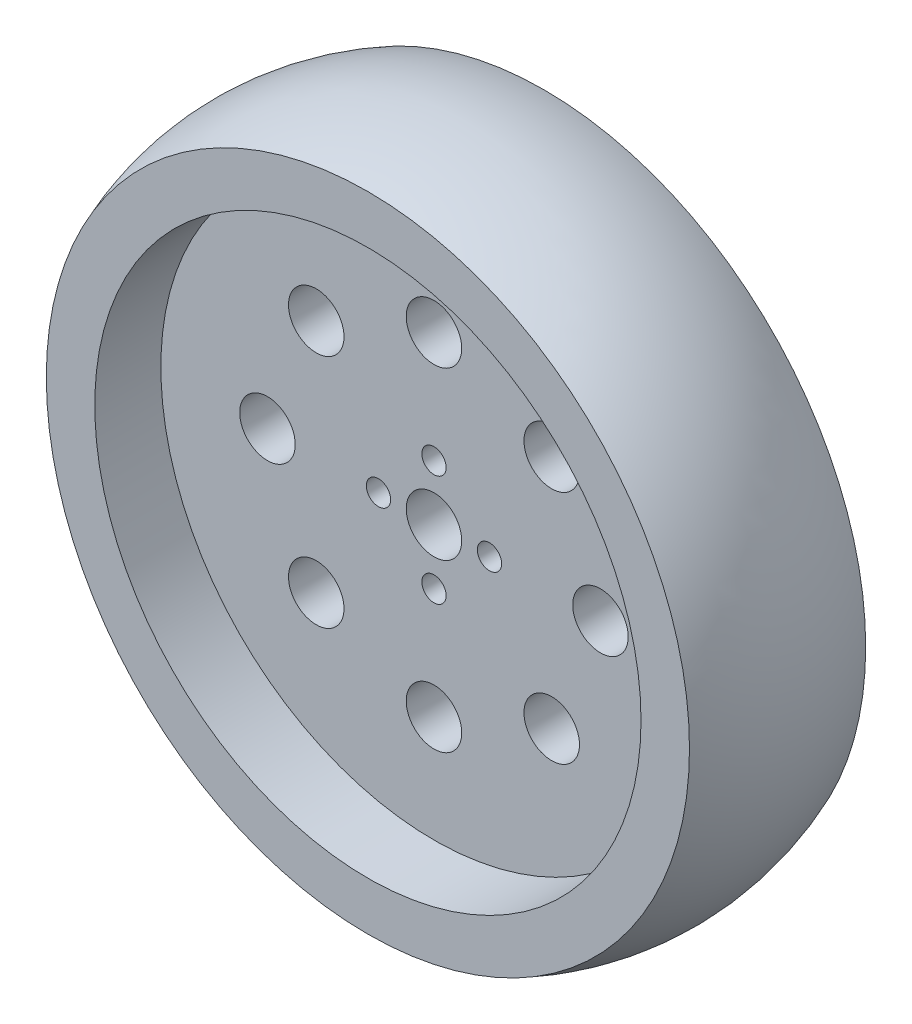
ISO-10303-21;
HEADER;
FILE_DESCRIPTION(('STEP AP214'),'2;1');
FILE_NAME('part.step','',(''),(''),'','','');
FILE_SCHEMA(('AUTOMOTIVE_DESIGN { 1 0 10303 214 1 1 1 1 }'));
ENDSEC;
DATA;
#1=APPLICATION_CONTEXT('core data for automotive mechanical design processes');
#2=APPLICATION_PROTOCOL_DEFINITION('international standard','automotive_design',2000,#1);
#3=PRODUCT_CONTEXT('',#1,'mechanical');
#4=PRODUCT('Part','Part','',(#3));
#5=PRODUCT_RELATED_PRODUCT_CATEGORY('part','',(#4));
#6=PRODUCT_DEFINITION_FORMATION('','',#4);
#7=PRODUCT_DEFINITION_CONTEXT('part definition',#1,'design');
#8=PRODUCT_DEFINITION('design','',#6,#7);
#9=PRODUCT_DEFINITION_SHAPE('','',#8);
#10=(LENGTH_UNIT() NAMED_UNIT(*) SI_UNIT(.MILLI.,.METRE.));
#11=(NAMED_UNIT(*) PLANE_ANGLE_UNIT() SI_UNIT($,.RADIAN.));
#12=(NAMED_UNIT(*) SI_UNIT($,.STERADIAN.) SOLID_ANGLE_UNIT());
#13=UNCERTAINTY_MEASURE_WITH_UNIT(LENGTH_MEASURE(1.E-05),#10,'distance_accuracy_value','');
#14=(GEOMETRIC_REPRESENTATION_CONTEXT(3) GLOBAL_UNCERTAINTY_ASSIGNED_CONTEXT((#13)) GLOBAL_UNIT_ASSIGNED_CONTEXT((#10,
#11,#12)) REPRESENTATION_CONTEXT('',''));
#15=CARTESIAN_POINT('',(0.,0.,0.));
#16=DIRECTION('',(0.,0.,1.));
#17=DIRECTION('',(1.,0.,0.));
#18=AXIS2_PLACEMENT_3D('',#15,#16,#17);
#19=CARTESIAN_POINT('',(-25.2639135472918,11.9697290917884,17.899365564863));
#20=DIRECTION('',(0.,0.,1.));
#21=DIRECTION('',(1.,0.,0.));
#22=AXIS2_PLACEMENT_3D('',#19,#20,#21);
#23=PLANE('',#22);
#24=CARTESIAN_POINT('',(-25.2639135472918,11.9697290917884,17.899365564863));
#25=DIRECTION('',(0.,0.,1.));
#26=DIRECTION('',(1.,0.,0.));
#27=AXIS2_PLACEMENT_3D('',#24,#25,#26);
#28=CIRCLE('',#27,39.37);
#29=CARTESIAN_POINT('',(14.1060864527081,11.9697290917884,17.899365564863));
#30=VERTEX_POINT('',#29);
#31=EDGE_CURVE('E34',#30,#30,#28,.T.);
#32=ORIENTED_EDGE('',*,*,#31,.F.);
#33=EDGE_LOOP('',(#32));
#34=FACE_BOUND('',#33,.T.);
#35=CARTESIAN_POINT('',(-25.2639135472918,11.9697290917884,17.899365564863));
#36=DIRECTION('',(0.,0.,-1.));
#37=DIRECTION('',(-1.,0.,0.));
#38=AXIS2_PLACEMENT_3D('',#35,#36,#37);
#39=CIRCLE('',#38,46.355);
#40=CARTESIAN_POINT('',(-71.6189135472918,11.9697290917884,17.899365564863));
#41=VERTEX_POINT('',#40);
#42=EDGE_CURVE('E132',#41,#41,#39,.T.);
#43=ORIENTED_EDGE('',*,*,#42,.F.);
#44=EDGE_LOOP('',(#43));
#45=FACE_BOUND('',#44,.T.);
#46=ADVANCED_FACE('F14',(#34,#45),#23,.T.);
#47=CARTESIAN_POINT('',(-25.2639135472918,11.9697290917884,8.374365564863));
#48=DIRECTION('',(0.,0.,1.));
#49=DIRECTION('',(1.,0.,0.));
#50=AXIS2_PLACEMENT_3D('',#47,#48,#49);
#51=PLANE('',#50);
#52=CARTESIAN_POINT('',(-42.234476295769,28.9402918402655,8.374365564863));
#53=DIRECTION('',(0.,0.,1.));
#54=DIRECTION('',(1.,0.,0.));
#55=AXIS2_PLACEMENT_3D('',#52,#53,#54);
#56=CIRCLE('',#55,4.);
#57=CARTESIAN_POINT('',(-38.234476295769,28.9402918402655,8.374365564863));
#58=VERTEX_POINT('',#57);
#59=EDGE_CURVE('E104',#58,#58,#56,.T.);
#60=ORIENTED_EDGE('',*,*,#59,.F.);
#61=EDGE_LOOP('',(#60));
#62=FACE_BOUND('',#61,.T.);
#63=CARTESIAN_POINT('',(-42.234476295769,-5.00083365668874,8.374365564863));
#64=DIRECTION('',(0.,0.,1.));
#65=DIRECTION('',(1.,0.,0.));
#66=AXIS2_PLACEMENT_3D('',#63,#64,#65);
#67=CIRCLE('',#66,4.);
#68=CARTESIAN_POINT('',(-38.234476295769,-5.00083365668874,8.374365564863));
#69=VERTEX_POINT('',#68);
#70=EDGE_CURVE('E94',#69,#69,#67,.T.);
#71=ORIENTED_EDGE('',*,*,#70,.F.);
#72=EDGE_LOOP('',(#71));
#73=FACE_BOUND('',#72,.T.);
#74=CARTESIAN_POINT('',(-8.29335079881471,-5.00083365668874,8.374365564863));
#75=DIRECTION('',(0.,0.,1.));
#76=DIRECTION('',(1.,0.,0.));
#77=AXIS2_PLACEMENT_3D('',#74,#75,#76);
#78=CIRCLE('',#77,4.);
#79=CARTESIAN_POINT('',(-4.29335079881471,-5.00083365668874,8.374365564863));
#80=VERTEX_POINT('',#79);
#81=EDGE_CURVE('E91',#80,#80,#78,.T.);
#82=ORIENTED_EDGE('',*,*,#81,.F.);
#83=EDGE_LOOP('',(#82));
#84=FACE_BOUND('',#83,.T.);
#85=CARTESIAN_POINT('',(-8.29335079881471,28.9402918402655,8.374365564863));
#86=DIRECTION('',(0.,0.,1.));
#87=DIRECTION('',(1.,0.,0.));
#88=AXIS2_PLACEMENT_3D('',#85,#86,#87);
#89=CIRCLE('',#88,4.);
#90=CARTESIAN_POINT('',(-4.29335079881471,28.9402918402655,8.374365564863));
#91=VERTEX_POINT('',#90);
#92=EDGE_CURVE('E88',#91,#91,#89,.T.);
#93=ORIENTED_EDGE('',*,*,#92,.F.);
#94=EDGE_LOOP('',(#93));
#95=FACE_BOUND('',#94,.T.);
#96=CARTESIAN_POINT('',(-49.2639135472918,11.9697290917884,8.374365564863));
#97=DIRECTION('',(0.,0.,1.));
#98=DIRECTION('',(1.,0.,0.));
#99=AXIS2_PLACEMENT_3D('',#96,#97,#98);
#100=CIRCLE('',#99,4.);
#101=CARTESIAN_POINT('',(-45.2639135472919,11.9697290917884,8.374365564863));
#102=VERTEX_POINT('',#101);
#103=EDGE_CURVE('E84',#102,#102,#100,.T.);
#104=ORIENTED_EDGE('',*,*,#103,.F.);
#105=EDGE_LOOP('',(#104));
#106=FACE_BOUND('',#105,.T.);
#107=CARTESIAN_POINT('',(-25.2639135472918,-12.0302709082116,8.374365564863));
#108=DIRECTION('',(0.,0.,1.));
#109=DIRECTION('',(1.,0.,0.));
#110=AXIS2_PLACEMENT_3D('',#107,#108,#109);
#111=CIRCLE('',#110,4.);
#112=CARTESIAN_POINT('',(-21.2639135472918,-12.0302709082116,8.374365564863));
#113=VERTEX_POINT('',#112);
#114=EDGE_CURVE('E80',#113,#113,#111,.T.);
#115=ORIENTED_EDGE('',*,*,#114,.F.);
#116=EDGE_LOOP('',(#115));
#117=FACE_BOUND('',#116,.T.);
#118=CARTESIAN_POINT('',(-1.26391354729185,11.9697290917884,8.374365564863));
#119=DIRECTION('',(0.,0.,1.));
#120=DIRECTION('',(1.,0.,0.));
#121=AXIS2_PLACEMENT_3D('',#118,#119,#120);
#122=CIRCLE('',#121,4.00000000000001);
#123=CARTESIAN_POINT('',(2.73608645270816,11.9697290917884,8.374365564863));
#124=VERTEX_POINT('',#123);
#125=EDGE_CURVE('E76',#124,#124,#122,.T.);
#126=ORIENTED_EDGE('',*,*,#125,.F.);
#127=EDGE_LOOP('',(#126));
#128=FACE_BOUND('',#127,.T.);
#129=CARTESIAN_POINT('',(-25.2639135472918,35.9697290917884,8.374365564863));
#130=DIRECTION('',(0.,0.,1.));
#131=DIRECTION('',(1.,0.,0.));
#132=AXIS2_PLACEMENT_3D('',#129,#130,#131);
#133=CIRCLE('',#132,4.);
#134=CARTESIAN_POINT('',(-21.2639135472918,35.9697290917884,8.374365564863));
#135=VERTEX_POINT('',#134);
#136=EDGE_CURVE('E72',#135,#135,#133,.T.);
#137=ORIENTED_EDGE('',*,*,#136,.F.);
#138=EDGE_LOOP('',(#137));
#139=FACE_BOUND('',#138,.T.);
#140=CARTESIAN_POINT('',(-33.2639135472918,11.9697290917884,8.374365564863));
#141=DIRECTION('',(0.,0.,1.));
#142=DIRECTION('',(1.,0.,0.));
#143=AXIS2_PLACEMENT_3D('',#140,#141,#142);
#144=CIRCLE('',#143,1.75);
#145=CARTESIAN_POINT('',(-31.5139135472918,11.9697290917884,8.374365564863));
#146=VERTEX_POINT('',#145);
#147=EDGE_CURVE('E68',#146,#146,#144,.T.);
#148=ORIENTED_EDGE('',*,*,#147,.F.);
#149=EDGE_LOOP('',(#148));
#150=FACE_BOUND('',#149,.T.);
#151=CARTESIAN_POINT('',(-25.2639135472918,3.96972909178839,8.374365564863));
#152=DIRECTION('',(0.,0.,1.));
#153=DIRECTION('',(1.,0.,0.));
#154=AXIS2_PLACEMENT_3D('',#151,#152,#153);
#155=CIRCLE('',#154,1.75);
#156=CARTESIAN_POINT('',(-23.5139135472919,3.96972909178839,8.374365564863));
#157=VERTEX_POINT('',#156);
#158=EDGE_CURVE('E64',#157,#157,#155,.T.);
#159=ORIENTED_EDGE('',*,*,#158,.F.);
#160=EDGE_LOOP('',(#159));
#161=FACE_BOUND('',#160,.T.);
#162=CARTESIAN_POINT('',(-17.2639135472918,11.9697290917884,8.374365564863));
#163=DIRECTION('',(0.,0.,1.));
#164=DIRECTION('',(1.,0.,0.));
#165=AXIS2_PLACEMENT_3D('',#162,#163,#164);
#166=CIRCLE('',#165,1.75);
#167=CARTESIAN_POINT('',(-15.5139135472918,11.9697290917884,8.374365564863));
#168=VERTEX_POINT('',#167);
#169=EDGE_CURVE('E60',#168,#168,#166,.T.);
#170=ORIENTED_EDGE('',*,*,#169,.F.);
#171=EDGE_LOOP('',(#170));
#172=FACE_BOUND('',#171,.T.);
#173=CARTESIAN_POINT('',(-25.2639135472918,19.9697290917884,8.374365564863));
#174=DIRECTION('',(0.,0.,1.));
#175=DIRECTION('',(1.,0.,0.));
#176=AXIS2_PLACEMENT_3D('',#173,#174,#175);
#177=CIRCLE('',#176,1.75);
#178=CARTESIAN_POINT('',(-23.5139135472919,19.9697290917884,8.374365564863));
#179=VERTEX_POINT('',#178);
#180=EDGE_CURVE('E56',#179,#179,#177,.T.);
#181=ORIENTED_EDGE('',*,*,#180,.F.);
#182=EDGE_LOOP('',(#181));
#183=FACE_BOUND('',#182,.T.);
#184=CARTESIAN_POINT('',(-25.2639135472918,11.9697290917884,8.374365564863));
#185=DIRECTION('',(0.,0.,1.));
#186=DIRECTION('',(1.,0.,0.));
#187=AXIS2_PLACEMENT_3D('',#184,#185,#186);
#188=CIRCLE('',#187,4.);
#189=CARTESIAN_POINT('',(-21.2639135472918,11.9697290917884,8.374365564863));
#190=VERTEX_POINT('',#189);
#191=EDGE_CURVE('E52',#190,#190,#188,.T.);
#192=ORIENTED_EDGE('',*,*,#191,.F.);
#193=EDGE_LOOP('',(#192));
#194=FACE_BOUND('',#193,.T.);
#195=CARTESIAN_POINT('',(-25.2639135472918,11.9697290917884,8.374365564863));
#196=DIRECTION('',(0.,0.,1.));
#197=DIRECTION('',(1.,0.,0.));
#198=AXIS2_PLACEMENT_3D('',#195,#196,#197);
#199=CIRCLE('',#198,39.37);
#200=CARTESIAN_POINT('',(14.1060864527081,11.9697290917884,8.374365564863));
#201=VERTEX_POINT('',#200);
#202=EDGE_CURVE('E24',#201,#201,#199,.T.);
#203=ORIENTED_EDGE('',*,*,#202,.T.);
#204=EDGE_LOOP('',(#203));
#205=FACE_BOUND('',#204,.T.);
#206=ADVANCED_FACE('F166',(#62,#73,#84,#95,#106,#117,#128,#139,#150,#161,#172,#183,#194,#205),
#51,.T.);
#207=CARTESIAN_POINT('',(-25.2639135472918,11.9697290917884,8.374365564863));
#208=DIRECTION('',(0.,0.,1.));
#209=DIRECTION('',(1.,0.,0.));
#210=AXIS2_PLACEMENT_3D('',#207,#208,#209);
#211=CYLINDRICAL_SURFACE('',#210,39.37);
#212=ORIENTED_EDGE('',*,*,#202,.F.);
#213=EDGE_LOOP('',(#212));
#214=FACE_BOUND('',#213,.T.);
#215=ORIENTED_EDGE('',*,*,#31,.T.);
#216=EDGE_LOOP('',(#215));
#217=FACE_BOUND('',#216,.T.);
#218=ADVANCED_FACE('F157',(#214,#217),#211,.F.);
#219=CARTESIAN_POINT('',(-25.2639135472918,11.9697290917884,5.19936556486302));
#220=DIRECTION('',(0.,0.,-1.));
#221=DIRECTION('',(-1.,0.,0.));
#222=AXIS2_PLACEMENT_3D('',#219,#220,#221);
#223=DEGENERATE_TOROIDAL_SURFACE('',#222,14.5789335348127,34.22,.T.);
#224=CARTESIAN_POINT('',(-25.2639135472918,11.9697290917884,-7.500634435137));
#225=DIRECTION('',(0.,0.,-1.));
#226=DIRECTION('',(-1.,0.,0.));
#227=AXIS2_PLACEMENT_3D('',#224,#225,#226);
#228=CIRCLE('',#227,46.355);
#229=CARTESIAN_POINT('',(-71.6189135472918,11.9697290917884,-7.500634435137));
#230=VERTEX_POINT('',#229);
#231=EDGE_CURVE('E51',#230,#230,#228,.T.);
#232=ORIENTED_EDGE('',*,*,#231,.F.);
#233=EDGE_LOOP('',(#232));
#234=FACE_BOUND('',#233,.T.);
#235=ORIENTED_EDGE('',*,*,#42,.T.);
#236=EDGE_LOOP('',(#235));
#237=FACE_BOUND('',#236,.T.);
#238=ADVANCED_FACE('F153',(#234,#237),#223,.T.);
#239=CARTESIAN_POINT('',(-25.2639135472918,11.9697290917884,2.024365564863));
#240=DIRECTION('',(0.,0.,-1.));
#241=DIRECTION('',(-1.,0.,0.));
#242=AXIS2_PLACEMENT_3D('',#239,#240,#241);
#243=PLANE('',#242);
#244=CARTESIAN_POINT('',(-42.234476295769,28.9402918402655,2.024365564863));
#245=DIRECTION('',(0.,0.,-1.));
#246=DIRECTION('',(-1.,0.,0.));
#247=AXIS2_PLACEMENT_3D('',#244,#245,#246);
#248=CIRCLE('',#247,4.);
#249=CARTESIAN_POINT('',(-46.234476295769,28.9402918402655,2.024365564863));
#250=VERTEX_POINT('',#249);
#251=EDGE_CURVE('E19',#250,#250,#248,.T.);
#252=ORIENTED_EDGE('',*,*,#251,.F.);
#253=EDGE_LOOP('',(#252));
#254=FACE_BOUND('',#253,.T.);
#255=CARTESIAN_POINT('',(-42.234476295769,-5.00083365668874,2.024365564863));
#256=DIRECTION('',(0.,0.,-1.));
#257=DIRECTION('',(-1.,0.,0.));
#258=AXIS2_PLACEMENT_3D('',#255,#256,#257);
#259=CIRCLE('',#258,4.);
#260=CARTESIAN_POINT('',(-46.234476295769,-5.00083365668874,2.024365564863));
#261=VERTEX_POINT('',#260);
#262=EDGE_CURVE('E92',#261,#261,#259,.T.);
#263=ORIENTED_EDGE('',*,*,#262,.F.);
#264=EDGE_LOOP('',(#263));
#265=FACE_BOUND('',#264,.T.);
#266=CARTESIAN_POINT('',(-8.29335079881471,-5.00083365668874,2.024365564863));
#267=DIRECTION('',(0.,0.,-1.));
#268=DIRECTION('',(-1.,0.,0.));
#269=AXIS2_PLACEMENT_3D('',#266,#267,#268);
#270=CIRCLE('',#269,4.);
#271=CARTESIAN_POINT('',(-12.2933507988147,-5.00083365668874,2.024365564863));
#272=VERTEX_POINT('',#271);
#273=EDGE_CURVE('E89',#272,#272,#270,.T.);
#274=ORIENTED_EDGE('',*,*,#273,.F.);
#275=EDGE_LOOP('',(#274));
#276=FACE_BOUND('',#275,.T.);
#277=CARTESIAN_POINT('',(-8.29335079881471,28.9402918402655,2.024365564863));
#278=DIRECTION('',(0.,0.,-1.));
#279=DIRECTION('',(-1.,0.,0.));
#280=AXIS2_PLACEMENT_3D('',#277,#278,#279);
#281=CIRCLE('',#280,4.);
#282=CARTESIAN_POINT('',(-12.2933507988147,28.9402918402655,2.024365564863));
#283=VERTEX_POINT('',#282);
#284=EDGE_CURVE('E85',#283,#283,#281,.T.);
#285=ORIENTED_EDGE('',*,*,#284,.F.);
#286=EDGE_LOOP('',(#285));
#287=FACE_BOUND('',#286,.T.);
#288=CARTESIAN_POINT('',(-49.2639135472918,11.9697290917884,2.024365564863));
#289=DIRECTION('',(0.,0.,-1.));
#290=DIRECTION('',(-1.,0.,0.));
#291=AXIS2_PLACEMENT_3D('',#288,#289,#290);
#292=CIRCLE('',#291,4.);
#293=CARTESIAN_POINT('',(-53.2639135472918,11.9697290917884,2.024365564863));
#294=VERTEX_POINT('',#293);
#295=EDGE_CURVE('E81',#294,#294,#292,.T.);
#296=ORIENTED_EDGE('',*,*,#295,.F.);
#297=EDGE_LOOP('',(#296));
#298=FACE_BOUND('',#297,.T.);
#299=CARTESIAN_POINT('',(-25.2639135472918,-12.0302709082116,2.024365564863));
#300=DIRECTION('',(0.,0.,-1.));
#301=DIRECTION('',(-1.,0.,0.));
#302=AXIS2_PLACEMENT_3D('',#299,#300,#301);
#303=CIRCLE('',#302,4.);
#304=CARTESIAN_POINT('',(-29.2639135472918,-12.0302709082116,2.024365564863));
#305=VERTEX_POINT('',#304);
#306=EDGE_CURVE('E77',#305,#305,#303,.T.);
#307=ORIENTED_EDGE('',*,*,#306,.F.);
#308=EDGE_LOOP('',(#307));
#309=FACE_BOUND('',#308,.T.);
#310=CARTESIAN_POINT('',(-1.26391354729185,11.9697290917884,2.024365564863));
#311=DIRECTION('',(0.,0.,-1.));
#312=DIRECTION('',(-1.,0.,0.));
#313=AXIS2_PLACEMENT_3D('',#310,#311,#312);
#314=CIRCLE('',#313,4.00000000000001);
#315=CARTESIAN_POINT('',(-5.26391354729186,11.9697290917884,2.024365564863));
#316=VERTEX_POINT('',#315);
#317=EDGE_CURVE('E73',#316,#316,#314,.T.);
#318=ORIENTED_EDGE('',*,*,#317,.F.);
#319=EDGE_LOOP('',(#318));
#320=FACE_BOUND('',#319,.T.);
#321=CARTESIAN_POINT('',(-25.2639135472918,35.9697290917884,2.024365564863));
#322=DIRECTION('',(0.,0.,-1.));
#323=DIRECTION('',(-1.,0.,0.));
#324=AXIS2_PLACEMENT_3D('',#321,#322,#323);
#325=CIRCLE('',#324,4.);
#326=CARTESIAN_POINT('',(-29.2639135472918,35.9697290917884,2.024365564863));
#327=VERTEX_POINT('',#326);
#328=EDGE_CURVE('E69',#327,#327,#325,.T.);
#329=ORIENTED_EDGE('',*,*,#328,.F.);
#330=EDGE_LOOP('',(#329));
#331=FACE_BOUND('',#330,.T.);
#332=CARTESIAN_POINT('',(-33.2639135472918,11.9697290917884,2.024365564863));
#333=DIRECTION('',(0.,0.,-1.));
#334=DIRECTION('',(-1.,0.,0.));
#335=AXIS2_PLACEMENT_3D('',#332,#333,#334);
#336=CIRCLE('',#335,1.75);
#337=CARTESIAN_POINT('',(-35.0139135472918,11.9697290917884,2.024365564863));
#338=VERTEX_POINT('',#337);
#339=EDGE_CURVE('E65',#338,#338,#336,.T.);
#340=ORIENTED_EDGE('',*,*,#339,.F.);
#341=EDGE_LOOP('',(#340));
#342=FACE_BOUND('',#341,.T.);
#343=CARTESIAN_POINT('',(-25.2639135472918,3.96972909178839,2.024365564863));
#344=DIRECTION('',(0.,0.,-1.));
#345=DIRECTION('',(-1.,0.,0.));
#346=AXIS2_PLACEMENT_3D('',#343,#344,#345);
#347=CIRCLE('',#346,1.75);
#348=CARTESIAN_POINT('',(-27.0139135472918,3.96972909178839,2.024365564863));
#349=VERTEX_POINT('',#348);
#350=EDGE_CURVE('E61',#349,#349,#347,.T.);
#351=ORIENTED_EDGE('',*,*,#350,.F.);
#352=EDGE_LOOP('',(#351));
#353=FACE_BOUND('',#352,.T.);
#354=CARTESIAN_POINT('',(-17.2639135472918,11.9697290917884,2.024365564863));
#355=DIRECTION('',(0.,0.,-1.));
#356=DIRECTION('',(-1.,0.,0.));
#357=AXIS2_PLACEMENT_3D('',#354,#355,#356);
#358=CIRCLE('',#357,1.75);
#359=CARTESIAN_POINT('',(-19.0139135472918,11.9697290917884,2.024365564863));
#360=VERTEX_POINT('',#359);
#361=EDGE_CURVE('E57',#360,#360,#358,.T.);
#362=ORIENTED_EDGE('',*,*,#361,.F.);
#363=EDGE_LOOP('',(#362));
#364=FACE_BOUND('',#363,.T.);
#365=CARTESIAN_POINT('',(-25.2639135472918,19.9697290917884,2.024365564863));
#366=DIRECTION('',(0.,0.,-1.));
#367=DIRECTION('',(-1.,0.,0.));
#368=AXIS2_PLACEMENT_3D('',#365,#366,#367);
#369=CIRCLE('',#368,1.75);
#370=CARTESIAN_POINT('',(-27.0139135472918,19.9697290917884,2.024365564863));
#371=VERTEX_POINT('',#370);
#372=EDGE_CURVE('E53',#371,#371,#369,.T.);
#373=ORIENTED_EDGE('',*,*,#372,.F.);
#374=EDGE_LOOP('',(#373));
#375=FACE_BOUND('',#374,.T.);
#376=CARTESIAN_POINT('',(-25.2639135472918,11.9697290917884,2.024365564863));
#377=DIRECTION('',(0.,0.,-1.));
#378=DIRECTION('',(-1.,0.,0.));
#379=AXIS2_PLACEMENT_3D('',#376,#377,#378);
#380=CIRCLE('',#379,4.);
#381=CARTESIAN_POINT('',(-29.2639135472918,11.9697290917884,2.024365564863));
#382=VERTEX_POINT('',#381);
#383=EDGE_CURVE('E43',#382,#382,#380,.T.);
#384=ORIENTED_EDGE('',*,*,#383,.F.);
#385=EDGE_LOOP('',(#384));
#386=FACE_BOUND('',#385,.T.);
#387=CARTESIAN_POINT('',(-25.2639135472918,11.9697290917884,2.024365564863));
#388=DIRECTION('',(0.,0.,-1.));
#389=DIRECTION('',(-1.,0.,0.));
#390=AXIS2_PLACEMENT_3D('',#387,#388,#389);
#391=CIRCLE('',#390,39.37);
#392=CARTESIAN_POINT('',(-64.6339135472918,11.9697290917884,2.024365564863));
#393=VERTEX_POINT('',#392);
#394=EDGE_CURVE('E29',#393,#393,#391,.T.);
#395=ORIENTED_EDGE('',*,*,#394,.T.);
#396=EDGE_LOOP('',(#395));
#397=FACE_BOUND('',#396,.T.);
#398=ADVANCED_FACE('F156',(#254,#265,#276,#287,#298,#309,#320,#331,#342,#353,#364,#375,#386,
#397),#243,.T.);
#399=CARTESIAN_POINT('',(-25.2639135472918,11.9697290917884,2.024365564863));
#400=DIRECTION('',(0.,0.,-1.));
#401=DIRECTION('',(-1.,0.,0.));
#402=AXIS2_PLACEMENT_3D('',#399,#400,#401);
#403=CYLINDRICAL_SURFACE('',#402,39.37);
#404=ORIENTED_EDGE('',*,*,#394,.F.);
#405=EDGE_LOOP('',(#404));
#406=FACE_BOUND('',#405,.T.);
#407=CARTESIAN_POINT('',(-25.2639135472918,11.9697290917884,-7.500634435137));
#408=DIRECTION('',(0.,0.,-1.));
#409=DIRECTION('',(-1.,0.,0.));
#410=AXIS2_PLACEMENT_3D('',#407,#408,#409);
#411=CIRCLE('',#410,39.37);
#412=CARTESIAN_POINT('',(-64.6339135472918,11.9697290917884,-7.500634435137));
#413=VERTEX_POINT('',#412);
#414=EDGE_CURVE('E134',#413,#413,#411,.T.);
#415=ORIENTED_EDGE('',*,*,#414,.T.);
#416=EDGE_LOOP('',(#415));
#417=FACE_BOUND('',#416,.T.);
#418=ADVANCED_FACE('F162',(#406,#417),#403,.F.);
#419=CARTESIAN_POINT('',(-25.2639135472918,11.9697290917884,-7.500634435137));
#420=DIRECTION('',(0.,0.,-1.));
#421=DIRECTION('',(-1.,0.,0.));
#422=AXIS2_PLACEMENT_3D('',#419,#420,#421);
#423=PLANE('',#422);
#424=ORIENTED_EDGE('',*,*,#414,.F.);
#425=EDGE_LOOP('',(#424));
#426=FACE_BOUND('',#425,.T.);
#427=ORIENTED_EDGE('',*,*,#231,.T.);
#428=EDGE_LOOP('',(#427));
#429=FACE_BOUND('',#428,.T.);
#430=ADVANCED_FACE('F159',(#426,#429),#423,.T.);
#431=CARTESIAN_POINT('',(-25.2639135472918,11.9697290917884,-7.50063443513699));
#432=DIRECTION('',(0.,0.,1.));
#433=DIRECTION('',(1.,0.,0.));
#434=AXIS2_PLACEMENT_3D('',#431,#432,#433);
#435=CYLINDRICAL_SURFACE('',#434,4.);
#436=ORIENTED_EDGE('',*,*,#383,.T.);
#437=EDGE_LOOP('',(#436));
#438=FACE_BOUND('',#437,.T.);
#439=ORIENTED_EDGE('',*,*,#191,.T.);
#440=EDGE_LOOP('',(#439));
#441=FACE_BOUND('',#440,.T.);
#442=ADVANCED_FACE('F151',(#438,#441),#435,.F.);
#443=CARTESIAN_POINT('',(-25.2639135472918,19.9697290917884,-7.50063443513699));
#444=DIRECTION('',(0.,0.,1.));
#445=DIRECTION('',(1.,0.,0.));
#446=AXIS2_PLACEMENT_3D('',#443,#444,#445);
#447=CYLINDRICAL_SURFACE('',#446,1.75);
#448=ORIENTED_EDGE('',*,*,#372,.T.);
#449=EDGE_LOOP('',(#448));
#450=FACE_BOUND('',#449,.T.);
#451=ORIENTED_EDGE('',*,*,#180,.T.);
#452=EDGE_LOOP('',(#451));
#453=FACE_BOUND('',#452,.T.);
#454=ADVANCED_FACE('F219',(#450,#453),#447,.F.);
#455=CARTESIAN_POINT('',(-17.2639135472918,11.9697290917884,-7.50063443513699));
#456=DIRECTION('',(0.,0.,1.));
#457=DIRECTION('',(1.,0.,0.));
#458=AXIS2_PLACEMENT_3D('',#455,#456,#457);
#459=CYLINDRICAL_SURFACE('',#458,1.75);
#460=ORIENTED_EDGE('',*,*,#361,.T.);
#461=EDGE_LOOP('',(#460));
#462=FACE_BOUND('',#461,.T.);
#463=ORIENTED_EDGE('',*,*,#169,.T.);
#464=EDGE_LOOP('',(#463));
#465=FACE_BOUND('',#464,.T.);
#466=ADVANCED_FACE('F226',(#462,#465),#459,.F.);
#467=CARTESIAN_POINT('',(-25.2639135472918,3.96972909178839,-7.50063443513699));
#468=DIRECTION('',(0.,0.,1.));
#469=DIRECTION('',(1.,0.,0.));
#470=AXIS2_PLACEMENT_3D('',#467,#468,#469);
#471=CYLINDRICAL_SURFACE('',#470,1.75);
#472=ORIENTED_EDGE('',*,*,#350,.T.);
#473=EDGE_LOOP('',(#472));
#474=FACE_BOUND('',#473,.T.);
#475=ORIENTED_EDGE('',*,*,#158,.T.);
#476=EDGE_LOOP('',(#475));
#477=FACE_BOUND('',#476,.T.);
#478=ADVANCED_FACE('F233',(#474,#477),#471,.F.);
#479=CARTESIAN_POINT('',(-33.2639135472918,11.9697290917884,-7.50063443513699));
#480=DIRECTION('',(0.,0.,1.));
#481=DIRECTION('',(1.,0.,0.));
#482=AXIS2_PLACEMENT_3D('',#479,#480,#481);
#483=CYLINDRICAL_SURFACE('',#482,1.75);
#484=ORIENTED_EDGE('',*,*,#339,.T.);
#485=EDGE_LOOP('',(#484));
#486=FACE_BOUND('',#485,.T.);
#487=ORIENTED_EDGE('',*,*,#147,.T.);
#488=EDGE_LOOP('',(#487));
#489=FACE_BOUND('',#488,.T.);
#490=ADVANCED_FACE('F241',(#486,#489),#483,.F.);
#491=CARTESIAN_POINT('',(-25.2639135472918,35.9697290917884,-7.50063443513699));
#492=DIRECTION('',(0.,0.,1.));
#493=DIRECTION('',(1.,0.,0.));
#494=AXIS2_PLACEMENT_3D('',#491,#492,#493);
#495=CYLINDRICAL_SURFACE('',#494,4.);
#496=ORIENTED_EDGE('',*,*,#328,.T.);
#497=EDGE_LOOP('',(#496));
#498=FACE_BOUND('',#497,.T.);
#499=ORIENTED_EDGE('',*,*,#136,.T.);
#500=EDGE_LOOP('',(#499));
#501=FACE_BOUND('',#500,.T.);
#502=ADVANCED_FACE('F249',(#498,#501),#495,.F.);
#503=CARTESIAN_POINT('',(-1.26391354729185,11.9697290917884,-7.50063443513699));
#504=DIRECTION('',(0.,0.,1.));
#505=DIRECTION('',(1.,0.,0.));
#506=AXIS2_PLACEMENT_3D('',#503,#504,#505);
#507=CYLINDRICAL_SURFACE('',#506,4.00000000000001);
#508=ORIENTED_EDGE('',*,*,#317,.T.);
#509=EDGE_LOOP('',(#508));
#510=FACE_BOUND('',#509,.T.);
#511=ORIENTED_EDGE('',*,*,#125,.T.);
#512=EDGE_LOOP('',(#511));
#513=FACE_BOUND('',#512,.T.);
#514=ADVANCED_FACE('F257',(#510,#513),#507,.F.);
#515=CARTESIAN_POINT('',(-25.2639135472918,-12.0302709082116,-7.50063443513699));
#516=DIRECTION('',(0.,0.,1.));
#517=DIRECTION('',(1.,0.,0.));
#518=AXIS2_PLACEMENT_3D('',#515,#516,#517);
#519=CYLINDRICAL_SURFACE('',#518,4.);
#520=ORIENTED_EDGE('',*,*,#306,.T.);
#521=EDGE_LOOP('',(#520));
#522=FACE_BOUND('',#521,.T.);
#523=ORIENTED_EDGE('',*,*,#114,.T.);
#524=EDGE_LOOP('',(#523));
#525=FACE_BOUND('',#524,.T.);
#526=ADVANCED_FACE('F265',(#522,#525),#519,.F.);
#527=CARTESIAN_POINT('',(-49.2639135472918,11.9697290917884,-7.50063443513699));
#528=DIRECTION('',(0.,0.,1.));
#529=DIRECTION('',(1.,0.,0.));
#530=AXIS2_PLACEMENT_3D('',#527,#528,#529);
#531=CYLINDRICAL_SURFACE('',#530,4.);
#532=ORIENTED_EDGE('',*,*,#295,.T.);
#533=EDGE_LOOP('',(#532));
#534=FACE_BOUND('',#533,.T.);
#535=ORIENTED_EDGE('',*,*,#103,.T.);
#536=EDGE_LOOP('',(#535));
#537=FACE_BOUND('',#536,.T.);
#538=ADVANCED_FACE('F273',(#534,#537),#531,.F.);
#539=CARTESIAN_POINT('',(-8.29335079881471,28.9402918402655,-7.50063443513699));
#540=DIRECTION('',(0.,0.,1.));
#541=DIRECTION('',(1.,0.,0.));
#542=AXIS2_PLACEMENT_3D('',#539,#540,#541);
#543=CYLINDRICAL_SURFACE('',#542,4.);
#544=ORIENTED_EDGE('',*,*,#284,.T.);
#545=EDGE_LOOP('',(#544));
#546=FACE_BOUND('',#545,.T.);
#547=ORIENTED_EDGE('',*,*,#92,.T.);
#548=EDGE_LOOP('',(#547));
#549=FACE_BOUND('',#548,.T.);
#550=ADVANCED_FACE('F281',(#546,#549),#543,.F.);
#551=CARTESIAN_POINT('',(-8.29335079881471,-5.00083365668874,-7.50063443513699));
#552=DIRECTION('',(0.,0.,1.));
#553=DIRECTION('',(1.,0.,0.));
#554=AXIS2_PLACEMENT_3D('',#551,#552,#553);
#555=CYLINDRICAL_SURFACE('',#554,4.);
#556=ORIENTED_EDGE('',*,*,#273,.T.);
#557=EDGE_LOOP('',(#556));
#558=FACE_BOUND('',#557,.T.);
#559=ORIENTED_EDGE('',*,*,#81,.T.);
#560=EDGE_LOOP('',(#559));
#561=FACE_BOUND('',#560,.T.);
#562=ADVANCED_FACE('F289',(#558,#561),#555,.F.);
#563=CARTESIAN_POINT('',(-42.234476295769,-5.00083365668874,-7.50063443513699));
#564=DIRECTION('',(0.,0.,1.));
#565=DIRECTION('',(1.,0.,0.));
#566=AXIS2_PLACEMENT_3D('',#563,#564,#565);
#567=CYLINDRICAL_SURFACE('',#566,4.);
#568=ORIENTED_EDGE('',*,*,#262,.T.);
#569=EDGE_LOOP('',(#568));
#570=FACE_BOUND('',#569,.T.);
#571=ORIENTED_EDGE('',*,*,#70,.T.);
#572=EDGE_LOOP('',(#571));
#573=FACE_BOUND('',#572,.T.);
#574=ADVANCED_FACE('F297',(#570,#573),#567,.F.);
#575=CARTESIAN_POINT('',(-42.234476295769,28.9402918402655,-7.50063443513699));
#576=DIRECTION('',(0.,0.,1.));
#577=DIRECTION('',(1.,0.,0.));
#578=AXIS2_PLACEMENT_3D('',#575,#576,#577);
#579=CYLINDRICAL_SURFACE('',#578,4.);
#580=ORIENTED_EDGE('',*,*,#251,.T.);
#581=EDGE_LOOP('',(#580));
#582=FACE_BOUND('',#581,.T.);
#583=ORIENTED_EDGE('',*,*,#59,.T.);
#584=EDGE_LOOP('',(#583));
#585=FACE_BOUND('',#584,.T.);
#586=ADVANCED_FACE('F305',(#582,#585),#579,.F.);
#587=CLOSED_SHELL('',(#46,#206,#218,#238,#398,#418,#430,#442,#454,#466,#478,#490,#502,#514,#526,
#538,#550,#562,#574,#586));
#588=CARTESIAN_POINT('',(-25.2639135472918,11.9697290917884,-5.341634435137));
#589=DIRECTION('',(0.,0.,1.));
#590=DIRECTION('',(1.,0.,0.));
#591=AXIS2_PLACEMENT_3D('',#588,#589,#590);
#592=CYLINDRICAL_SURFACE('',#591,44.45);
#593=CARTESIAN_POINT('',(-25.2639135472918,11.9697290917884,-5.341634435137));
#594=DIRECTION('',(0.,0.,-1.));
#595=DIRECTION('',(-1.,0.,0.));
#596=AXIS2_PLACEMENT_3D('',#593,#594,#595);
#597=CIRCLE('',#596,44.45);
#598=CARTESIAN_POINT('',(-69.7139135472919,11.9697290917884,-5.341634435137));
#599=VERTEX_POINT('',#598);
#600=EDGE_CURVE('E129',#599,#599,#597,.T.);
#601=ORIENTED_EDGE('',*,*,#600,.F.);
#602=EDGE_LOOP('',(#601));
#603=FACE_BOUND('',#602,.T.);
#604=CARTESIAN_POINT('',(-25.2639135472918,11.9697290917884,15.740365564863));
#605=DIRECTION('',(0.,0.,1.));
#606=DIRECTION('',(-1.,0.,0.));
#607=AXIS2_PLACEMENT_3D('',#604,#605,#606);
#608=CIRCLE('',#607,44.4547996698888);
#609=CARTESIAN_POINT('',(-69.7187132171807,11.9697290917884,15.740365564863));
#610=VERTEX_POINT('',#609);
#611=EDGE_CURVE('E8',#610,#610,#608,.T.);
#612=ORIENTED_EDGE('',*,*,#611,.F.);
#613=EDGE_LOOP('',(#612));
#614=FACE_BOUND('',#613,.T.);
#615=ADVANCED_FACE('F16',(#603,#614),#592,.T.);
#616=CARTESIAN_POINT('',(-25.2639135472918,11.9697290917884,-5.341634435137));
#617=DIRECTION('',(0.,0.,1.));
#618=DIRECTION('',(1.,0.,0.));
#619=AXIS2_PLACEMENT_3D('',#616,#617,#618);
#620=CONICAL_SURFACE('',#619,44.45,0.00022766672070515);
#621=ORIENTED_EDGE('',*,*,#611,.T.);
#622=EDGE_LOOP('',(#621));
#623=FACE_BOUND('',#622,.T.);
#624=ORIENTED_EDGE('',*,*,#600,.T.);
#625=EDGE_LOOP('',(#624));
#626=FACE_BOUND('',#625,.T.);
#627=ADVANCED_FACE('F140',(#623,#626),#620,.F.);
#628=CLOSED_SHELL('',(#615,#627));
#629=ORIENTED_CLOSED_SHELL('',*,#628,.T.);
#630=BREP_WITH_VOIDS('B1',#587,(#629));
#631=ADVANCED_BREP_SHAPE_REPRESENTATION('',(#18,#630),#14);
#632=SHAPE_DEFINITION_REPRESENTATION(#9,#631);
ENDSEC;
END-ISO-10303-21;
